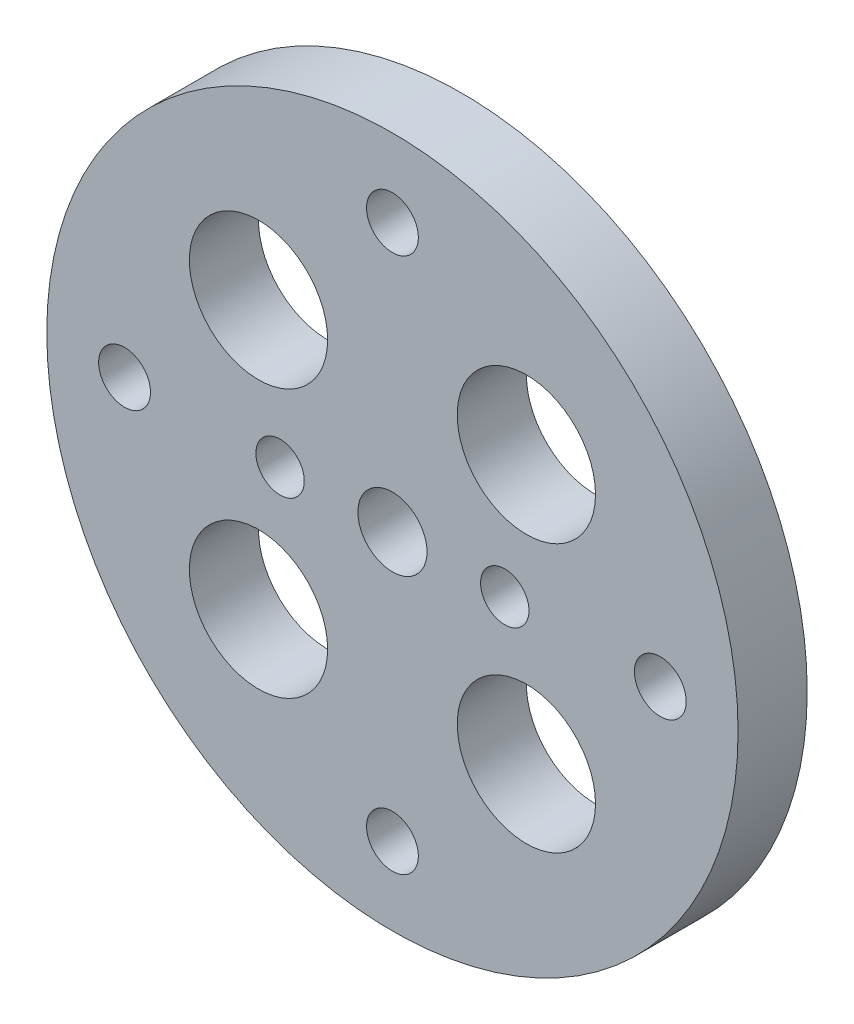
ISO-10303-21;
HEADER;
FILE_DESCRIPTION(('STEP AP214'),'2;1');
FILE_NAME('part.step','',(''),(''),'','','');
FILE_SCHEMA(('AUTOMOTIVE_DESIGN { 1 0 10303 214 1 1 1 1 }'));
ENDSEC;
DATA;
#1=APPLICATION_CONTEXT('core data for automotive mechanical design processes');
#2=APPLICATION_PROTOCOL_DEFINITION('international standard','automotive_design',2000,#1);
#3=PRODUCT_CONTEXT('',#1,'mechanical');
#4=PRODUCT('Part','Part','',(#3));
#5=PRODUCT_RELATED_PRODUCT_CATEGORY('part','',(#4));
#6=PRODUCT_DEFINITION_FORMATION('','',#4);
#7=PRODUCT_DEFINITION_CONTEXT('part definition',#1,'design');
#8=PRODUCT_DEFINITION('design','',#6,#7);
#9=PRODUCT_DEFINITION_SHAPE('','',#8);
#10=(LENGTH_UNIT() NAMED_UNIT(*) SI_UNIT(.MILLI.,.METRE.));
#11=(NAMED_UNIT(*) PLANE_ANGLE_UNIT() SI_UNIT($,.RADIAN.));
#12=(NAMED_UNIT(*) SI_UNIT($,.STERADIAN.) SOLID_ANGLE_UNIT());
#13=UNCERTAINTY_MEASURE_WITH_UNIT(LENGTH_MEASURE(1.E-05),#10,'distance_accuracy_value','');
#14=(GEOMETRIC_REPRESENTATION_CONTEXT(3) GLOBAL_UNCERTAINTY_ASSIGNED_CONTEXT((#13)) GLOBAL_UNIT_ASSIGNED_CONTEXT((#10,
#11,#12)) REPRESENTATION_CONTEXT('',''));
#15=CARTESIAN_POINT('',(0.,0.,0.));
#16=DIRECTION('',(0.,0.,1.));
#17=DIRECTION('',(1.,0.,0.));
#18=AXIS2_PLACEMENT_3D('',#15,#16,#17);
#19=CARTESIAN_POINT('',(0.,0.,4.));
#20=DIRECTION('',(0.,0.,1.));
#21=DIRECTION('',(1.,0.,0.));
#22=AXIS2_PLACEMENT_3D('',#19,#20,#21);
#23=PLANE('',#22);
#24=CARTESIAN_POINT('',(7.75000000000043,-7.74999999999957,4.));
#25=DIRECTION('',(0.,0.,1.));
#26=DIRECTION('',(1.,0.,0.));
#27=AXIS2_PLACEMENT_3D('',#24,#25,#26);
#28=CIRCLE('',#27,4.00000000000067);
#29=CARTESIAN_POINT('',(11.7500000000011,-7.74999999999957,4.));
#30=VERTEX_POINT('',#29);
#31=EDGE_CURVE('E120',#30,#30,#28,.T.);
#32=ORIENTED_EDGE('',*,*,#31,.F.);
#33=EDGE_LOOP('',(#32));
#34=FACE_BOUND('',#33,.T.);
#35=CARTESIAN_POINT('',(-7.75,7.75,4.));
#36=DIRECTION('',(0.,0.,1.));
#37=DIRECTION('',(1.,0.,0.));
#38=AXIS2_PLACEMENT_3D('',#35,#36,#37);
#39=CIRCLE('',#38,4.00000000000006);
#40=CARTESIAN_POINT('',(-3.74999999999994,7.75,4.));
#41=VERTEX_POINT('',#40);
#42=EDGE_CURVE('E104',#41,#41,#39,.T.);
#43=ORIENTED_EDGE('',*,*,#42,.F.);
#44=EDGE_LOOP('',(#43));
#45=FACE_BOUND('',#44,.T.);
#46=CARTESIAN_POINT('',(1.08235921504137E-13,15.5,4.));
#47=DIRECTION('',(0.,0.,1.));
#48=DIRECTION('',(1.,0.,0.));
#49=AXIS2_PLACEMENT_3D('',#46,#47,#48);
#50=CIRCLE('',#49,1.5);
#51=CARTESIAN_POINT('',(1.50000000000011,15.5,4.));
#52=VERTEX_POINT('',#51);
#53=EDGE_CURVE('E88',#52,#52,#50,.T.);
#54=ORIENTED_EDGE('',*,*,#53,.F.);
#55=EDGE_LOOP('',(#54));
#56=FACE_BOUND('',#55,.T.);
#57=CARTESIAN_POINT('',(-6.5,0.,4.));
#58=DIRECTION('',(0.,0.,1.));
#59=DIRECTION('',(-1.,0.,0.));
#60=AXIS2_PLACEMENT_3D('',#57,#58,#59);
#61=CIRCLE('',#60,1.4);
#62=CARTESIAN_POINT('',(-7.9,0.,4.));
#63=VERTEX_POINT('',#62);
#64=EDGE_CURVE('E72',#63,#63,#61,.T.);
#65=ORIENTED_EDGE('',*,*,#64,.F.);
#66=EDGE_LOOP('',(#65));
#67=FACE_BOUND('',#66,.T.);
#68=CARTESIAN_POINT('',(6.5,0.,4.));
#69=DIRECTION('',(0.,0.,1.));
#70=DIRECTION('',(1.,0.,0.));
#71=AXIS2_PLACEMENT_3D('',#68,#69,#70);
#72=CIRCLE('',#71,1.4);
#73=CARTESIAN_POINT('',(7.9,0.,4.));
#74=VERTEX_POINT('',#73);
#75=EDGE_CURVE('E56',#74,#74,#72,.T.);
#76=ORIENTED_EDGE('',*,*,#75,.F.);
#77=EDGE_LOOP('',(#76));
#78=FACE_BOUND('',#77,.T.);
#79=CARTESIAN_POINT('',(0.,0.,4.));
#80=DIRECTION('',(0.,0.,1.));
#81=DIRECTION('',(1.,0.,0.));
#82=AXIS2_PLACEMENT_3D('',#79,#80,#81);
#83=CIRCLE('',#82,20.);
#84=CARTESIAN_POINT('',(20.,0.,4.));
#85=VERTEX_POINT('',#84);
#86=EDGE_CURVE('E10',#85,#85,#83,.T.);
#87=ORIENTED_EDGE('',*,*,#86,.T.);
#88=EDGE_LOOP('',(#87));
#89=FACE_BOUND('',#88,.T.);
#90=CARTESIAN_POINT('',(0.,0.,4.));
#91=DIRECTION('',(0.,0.,1.));
#92=DIRECTION('',(1.,0.,0.));
#93=AXIS2_PLACEMENT_3D('',#90,#91,#92);
#94=CIRCLE('',#93,2.);
#95=CARTESIAN_POINT('',(2.,0.,4.));
#96=VERTEX_POINT('',#95);
#97=EDGE_CURVE('E50',#96,#96,#94,.T.);
#98=ORIENTED_EDGE('',*,*,#97,.F.);
#99=EDGE_LOOP('',(#98));
#100=FACE_BOUND('',#99,.T.);
#101=CARTESIAN_POINT('',(0.,-15.5,4.));
#102=DIRECTION('',(0.,0.,1.));
#103=DIRECTION('',(1.,0.,0.));
#104=AXIS2_PLACEMENT_3D('',#101,#102,#103);
#105=CIRCLE('',#104,1.5);
#106=CARTESIAN_POINT('',(1.5,-15.5,4.));
#107=VERTEX_POINT('',#106);
#108=EDGE_CURVE('E64',#107,#107,#105,.T.);
#109=ORIENTED_EDGE('',*,*,#108,.F.);
#110=EDGE_LOOP('',(#109));
#111=FACE_BOUND('',#110,.T.);
#112=CARTESIAN_POINT('',(-15.5,0.,4.));
#113=DIRECTION('',(0.,0.,1.));
#114=DIRECTION('',(1.,0.,0.));
#115=AXIS2_PLACEMENT_3D('',#112,#113,#114);
#116=CIRCLE('',#115,1.5);
#117=CARTESIAN_POINT('',(-14.,0.,4.));
#118=VERTEX_POINT('',#117);
#119=EDGE_CURVE('E80',#118,#118,#116,.T.);
#120=ORIENTED_EDGE('',*,*,#119,.F.);
#121=EDGE_LOOP('',(#120));
#122=FACE_BOUND('',#121,.T.);
#123=CARTESIAN_POINT('',(15.5,-1.62353882256206E-13,4.));
#124=DIRECTION('',(0.,0.,1.));
#125=DIRECTION('',(1.,0.,0.));
#126=AXIS2_PLACEMENT_3D('',#123,#124,#125);
#127=CIRCLE('',#126,1.5);
#128=CARTESIAN_POINT('',(17.,-1.62353882256206E-13,4.));
#129=VERTEX_POINT('',#128);
#130=EDGE_CURVE('E96',#129,#129,#127,.T.);
#131=ORIENTED_EDGE('',*,*,#130,.F.);
#132=EDGE_LOOP('',(#131));
#133=FACE_BOUND('',#132,.T.);
#134=CARTESIAN_POINT('',(7.75,7.75000000000043,4.));
#135=DIRECTION('',(0.,0.,1.));
#136=DIRECTION('',(1.,0.,0.));
#137=AXIS2_PLACEMENT_3D('',#134,#135,#136);
#138=CIRCLE('',#137,4.00000000000051);
#139=CARTESIAN_POINT('',(11.7500000000005,7.75000000000043,4.));
#140=VERTEX_POINT('',#139);
#141=EDGE_CURVE('E112',#140,#140,#138,.T.);
#142=ORIENTED_EDGE('',*,*,#141,.F.);
#143=EDGE_LOOP('',(#142));
#144=FACE_BOUND('',#143,.T.);
#145=CARTESIAN_POINT('',(-7.74999999999957,-7.75,4.));
#146=DIRECTION('',(0.,0.,1.));
#147=DIRECTION('',(1.,0.,0.));
#148=AXIS2_PLACEMENT_3D('',#145,#146,#147);
#149=CIRCLE('',#148,4.00000000000029);
#150=CARTESIAN_POINT('',(-3.74999999999928,-7.75,4.));
#151=VERTEX_POINT('',#150);
#152=EDGE_CURVE('E128',#151,#151,#149,.T.);
#153=ORIENTED_EDGE('',*,*,#152,.F.);
#154=EDGE_LOOP('',(#153));
#155=FACE_BOUND('',#154,.T.);
#156=ADVANCED_FACE('F37',(#34,#45,#56,#67,#78,#89,#100,#111,#122,#133,#144,#155),#23,.T.);
#157=CARTESIAN_POINT('',(0.,0.,0.));
#158=DIRECTION('',(0.,0.,1.));
#159=DIRECTION('',(1.,0.,0.));
#160=AXIS2_PLACEMENT_3D('',#157,#158,#159);
#161=PLANE('',#160);
#162=CARTESIAN_POINT('',(0.,0.,0.));
#163=DIRECTION('',(0.,0.,1.));
#164=DIRECTION('',(1.,0.,0.));
#165=AXIS2_PLACEMENT_3D('',#162,#163,#164);
#166=CIRCLE('',#165,20.);
#167=CARTESIAN_POINT('',(20.,0.,0.));
#168=VERTEX_POINT('',#167);
#169=EDGE_CURVE('E41',#168,#168,#166,.T.);
#170=ORIENTED_EDGE('',*,*,#169,.F.);
#171=EDGE_LOOP('',(#170));
#172=FACE_BOUND('',#171,.T.);
#173=CARTESIAN_POINT('',(0.,0.,0.));
#174=DIRECTION('',(0.,0.,1.));
#175=DIRECTION('',(1.,0.,0.));
#176=AXIS2_PLACEMENT_3D('',#173,#174,#175);
#177=CIRCLE('',#176,2.);
#178=CARTESIAN_POINT('',(2.,0.,0.));
#179=VERTEX_POINT('',#178);
#180=EDGE_CURVE('E52',#179,#179,#177,.T.);
#181=ORIENTED_EDGE('',*,*,#180,.T.);
#182=EDGE_LOOP('',(#181));
#183=FACE_BOUND('',#182,.T.);
#184=CARTESIAN_POINT('',(6.5,0.,0.));
#185=DIRECTION('',(0.,0.,1.));
#186=DIRECTION('',(1.,0.,0.));
#187=AXIS2_PLACEMENT_3D('',#184,#185,#186);
#188=CIRCLE('',#187,1.4);
#189=CARTESIAN_POINT('',(7.9,0.,0.));
#190=VERTEX_POINT('',#189);
#191=EDGE_CURVE('E60',#190,#190,#188,.T.);
#192=ORIENTED_EDGE('',*,*,#191,.T.);
#193=EDGE_LOOP('',(#192));
#194=FACE_BOUND('',#193,.T.);
#195=CARTESIAN_POINT('',(0.,-15.5,0.));
#196=DIRECTION('',(0.,0.,1.));
#197=DIRECTION('',(1.,0.,0.));
#198=AXIS2_PLACEMENT_3D('',#195,#196,#197);
#199=CIRCLE('',#198,1.5);
#200=CARTESIAN_POINT('',(1.5,-15.5,0.));
#201=VERTEX_POINT('',#200);
#202=EDGE_CURVE('E68',#201,#201,#199,.T.);
#203=ORIENTED_EDGE('',*,*,#202,.T.);
#204=EDGE_LOOP('',(#203));
#205=FACE_BOUND('',#204,.T.);
#206=CARTESIAN_POINT('',(-6.5,0.,0.));
#207=DIRECTION('',(0.,0.,1.));
#208=DIRECTION('',(-1.,0.,0.));
#209=AXIS2_PLACEMENT_3D('',#206,#207,#208);
#210=CIRCLE('',#209,1.4);
#211=CARTESIAN_POINT('',(-7.9,0.,0.));
#212=VERTEX_POINT('',#211);
#213=EDGE_CURVE('E76',#212,#212,#210,.T.);
#214=ORIENTED_EDGE('',*,*,#213,.T.);
#215=EDGE_LOOP('',(#214));
#216=FACE_BOUND('',#215,.T.);
#217=CARTESIAN_POINT('',(-15.5,0.,0.));
#218=DIRECTION('',(0.,0.,1.));
#219=DIRECTION('',(1.,0.,0.));
#220=AXIS2_PLACEMENT_3D('',#217,#218,#219);
#221=CIRCLE('',#220,1.5);
#222=CARTESIAN_POINT('',(-14.,0.,0.));
#223=VERTEX_POINT('',#222);
#224=EDGE_CURVE('E84',#223,#223,#221,.T.);
#225=ORIENTED_EDGE('',*,*,#224,.T.);
#226=EDGE_LOOP('',(#225));
#227=FACE_BOUND('',#226,.T.);
#228=CARTESIAN_POINT('',(1.08235921504137E-13,15.5,0.));
#229=DIRECTION('',(0.,0.,1.));
#230=DIRECTION('',(1.,0.,0.));
#231=AXIS2_PLACEMENT_3D('',#228,#229,#230);
#232=CIRCLE('',#231,1.5);
#233=CARTESIAN_POINT('',(1.50000000000011,15.5,0.));
#234=VERTEX_POINT('',#233);
#235=EDGE_CURVE('E92',#234,#234,#232,.T.);
#236=ORIENTED_EDGE('',*,*,#235,.T.);
#237=EDGE_LOOP('',(#236));
#238=FACE_BOUND('',#237,.T.);
#239=CARTESIAN_POINT('',(15.5,-1.62353882256206E-13,0.));
#240=DIRECTION('',(0.,0.,1.));
#241=DIRECTION('',(1.,0.,0.));
#242=AXIS2_PLACEMENT_3D('',#239,#240,#241);
#243=CIRCLE('',#242,1.5);
#244=CARTESIAN_POINT('',(17.,-1.62353882256206E-13,0.));
#245=VERTEX_POINT('',#244);
#246=EDGE_CURVE('E100',#245,#245,#243,.T.);
#247=ORIENTED_EDGE('',*,*,#246,.T.);
#248=EDGE_LOOP('',(#247));
#249=FACE_BOUND('',#248,.T.);
#250=CARTESIAN_POINT('',(-7.75,7.75,0.));
#251=DIRECTION('',(0.,0.,1.));
#252=DIRECTION('',(1.,0.,0.));
#253=AXIS2_PLACEMENT_3D('',#250,#251,#252);
#254=CIRCLE('',#253,4.00000000000006);
#255=CARTESIAN_POINT('',(-3.74999999999994,7.75,0.));
#256=VERTEX_POINT('',#255);
#257=EDGE_CURVE('E108',#256,#256,#254,.T.);
#258=ORIENTED_EDGE('',*,*,#257,.T.);
#259=EDGE_LOOP('',(#258));
#260=FACE_BOUND('',#259,.T.);
#261=CARTESIAN_POINT('',(7.75,7.75000000000043,0.));
#262=DIRECTION('',(0.,0.,1.));
#263=DIRECTION('',(1.,0.,0.));
#264=AXIS2_PLACEMENT_3D('',#261,#262,#263);
#265=CIRCLE('',#264,4.00000000000051);
#266=CARTESIAN_POINT('',(11.7500000000005,7.75000000000043,0.));
#267=VERTEX_POINT('',#266);
#268=EDGE_CURVE('E116',#267,#267,#265,.T.);
#269=ORIENTED_EDGE('',*,*,#268,.T.);
#270=EDGE_LOOP('',(#269));
#271=FACE_BOUND('',#270,.T.);
#272=CARTESIAN_POINT('',(7.75000000000043,-7.74999999999957,0.));
#273=DIRECTION('',(0.,0.,1.));
#274=DIRECTION('',(1.,0.,0.));
#275=AXIS2_PLACEMENT_3D('',#272,#273,#274);
#276=CIRCLE('',#275,4.00000000000067);
#277=CARTESIAN_POINT('',(11.7500000000011,-7.74999999999957,0.));
#278=VERTEX_POINT('',#277);
#279=EDGE_CURVE('E124',#278,#278,#276,.T.);
#280=ORIENTED_EDGE('',*,*,#279,.T.);
#281=EDGE_LOOP('',(#280));
#282=FACE_BOUND('',#281,.T.);
#283=CARTESIAN_POINT('',(-7.74999999999957,-7.75,0.));
#284=DIRECTION('',(0.,0.,1.));
#285=DIRECTION('',(1.,0.,0.));
#286=AXIS2_PLACEMENT_3D('',#283,#284,#285);
#287=CIRCLE('',#286,4.00000000000029);
#288=CARTESIAN_POINT('',(-3.74999999999928,-7.75,0.));
#289=VERTEX_POINT('',#288);
#290=EDGE_CURVE('E132',#289,#289,#287,.T.);
#291=ORIENTED_EDGE('',*,*,#290,.T.);
#292=EDGE_LOOP('',(#291));
#293=FACE_BOUND('',#292,.T.);
#294=ADVANCED_FACE('F144',(#172,#183,#194,#205,#216,#227,#238,#249,#260,#271,#282,#293),#161,.F.);
#295=CARTESIAN_POINT('',(0.,0.,4.));
#296=DIRECTION('',(0.,0.,-1.));
#297=DIRECTION('',(-1.,0.,0.));
#298=AXIS2_PLACEMENT_3D('',#295,#296,#297);
#299=CYLINDRICAL_SURFACE('',#298,20.);
#300=ORIENTED_EDGE('',*,*,#86,.F.);
#301=EDGE_LOOP('',(#300));
#302=FACE_BOUND('',#301,.T.);
#303=ORIENTED_EDGE('',*,*,#169,.T.);
#304=EDGE_LOOP('',(#303));
#305=FACE_BOUND('',#304,.T.);
#306=ADVANCED_FACE('F39',(#302,#305),#299,.T.);
#307=CARTESIAN_POINT('',(0.,0.,4.));
#308=DIRECTION('',(0.,0.,-1.));
#309=DIRECTION('',(-1.,0.,0.));
#310=AXIS2_PLACEMENT_3D('',#307,#308,#309);
#311=CYLINDRICAL_SURFACE('',#310,2.);
#312=ORIENTED_EDGE('',*,*,#97,.T.);
#313=EDGE_LOOP('',(#312));
#314=FACE_BOUND('',#313,.T.);
#315=ORIENTED_EDGE('',*,*,#180,.F.);
#316=EDGE_LOOP('',(#315));
#317=FACE_BOUND('',#316,.T.);
#318=ADVANCED_FACE('F154',(#314,#317),#311,.F.);
#319=CARTESIAN_POINT('',(6.5,0.,4.));
#320=DIRECTION('',(0.,0.,-1.));
#321=DIRECTION('',(-1.,0.,0.));
#322=AXIS2_PLACEMENT_3D('',#319,#320,#321);
#323=CYLINDRICAL_SURFACE('',#322,1.4);
#324=ORIENTED_EDGE('',*,*,#75,.T.);
#325=EDGE_LOOP('',(#324));
#326=FACE_BOUND('',#325,.T.);
#327=ORIENTED_EDGE('',*,*,#191,.F.);
#328=EDGE_LOOP('',(#327));
#329=FACE_BOUND('',#328,.T.);
#330=ADVANCED_FACE('F157',(#326,#329),#323,.F.);
#331=CARTESIAN_POINT('',(0.,-15.5,4.));
#332=DIRECTION('',(0.,0.,-1.));
#333=DIRECTION('',(-1.,0.,0.));
#334=AXIS2_PLACEMENT_3D('',#331,#332,#333);
#335=CYLINDRICAL_SURFACE('',#334,1.5);
#336=ORIENTED_EDGE('',*,*,#108,.T.);
#337=EDGE_LOOP('',(#336));
#338=FACE_BOUND('',#337,.T.);
#339=ORIENTED_EDGE('',*,*,#202,.F.);
#340=EDGE_LOOP('',(#339));
#341=FACE_BOUND('',#340,.T.);
#342=ADVANCED_FACE('F161',(#338,#341),#335,.F.);
#343=CARTESIAN_POINT('',(-6.5,0.,4.));
#344=DIRECTION('',(0.,0.,-1.));
#345=DIRECTION('',(-1.,0.,0.));
#346=AXIS2_PLACEMENT_3D('',#343,#344,#345);
#347=CYLINDRICAL_SURFACE('',#346,1.4);
#348=ORIENTED_EDGE('',*,*,#64,.T.);
#349=EDGE_LOOP('',(#348));
#350=FACE_BOUND('',#349,.T.);
#351=ORIENTED_EDGE('',*,*,#213,.F.);
#352=EDGE_LOOP('',(#351));
#353=FACE_BOUND('',#352,.T.);
#354=ADVANCED_FACE('F165',(#350,#353),#347,.F.);
#355=CARTESIAN_POINT('',(-15.5,0.,4.));
#356=DIRECTION('',(0.,0.,-1.));
#357=DIRECTION('',(-1.,0.,0.));
#358=AXIS2_PLACEMENT_3D('',#355,#356,#357);
#359=CYLINDRICAL_SURFACE('',#358,1.5);
#360=ORIENTED_EDGE('',*,*,#119,.T.);
#361=EDGE_LOOP('',(#360));
#362=FACE_BOUND('',#361,.T.);
#363=ORIENTED_EDGE('',*,*,#224,.F.);
#364=EDGE_LOOP('',(#363));
#365=FACE_BOUND('',#364,.T.);
#366=ADVANCED_FACE('F169',(#362,#365),#359,.F.);
#367=CARTESIAN_POINT('',(1.08235921504137E-13,15.5,4.));
#368=DIRECTION('',(0.,0.,-1.));
#369=DIRECTION('',(-1.,0.,0.));
#370=AXIS2_PLACEMENT_3D('',#367,#368,#369);
#371=CYLINDRICAL_SURFACE('',#370,1.5);
#372=ORIENTED_EDGE('',*,*,#53,.T.);
#373=EDGE_LOOP('',(#372));
#374=FACE_BOUND('',#373,.T.);
#375=ORIENTED_EDGE('',*,*,#235,.F.);
#376=EDGE_LOOP('',(#375));
#377=FACE_BOUND('',#376,.T.);
#378=ADVANCED_FACE('F173',(#374,#377),#371,.F.);
#379=CARTESIAN_POINT('',(15.5,-1.62353882256206E-13,4.));
#380=DIRECTION('',(0.,0.,-1.));
#381=DIRECTION('',(-1.,0.,0.));
#382=AXIS2_PLACEMENT_3D('',#379,#380,#381);
#383=CYLINDRICAL_SURFACE('',#382,1.5);
#384=ORIENTED_EDGE('',*,*,#130,.T.);
#385=EDGE_LOOP('',(#384));
#386=FACE_BOUND('',#385,.T.);
#387=ORIENTED_EDGE('',*,*,#246,.F.);
#388=EDGE_LOOP('',(#387));
#389=FACE_BOUND('',#388,.T.);
#390=ADVANCED_FACE('F177',(#386,#389),#383,.F.);
#391=CARTESIAN_POINT('',(-7.75,7.75,4.));
#392=DIRECTION('',(0.,0.,-1.));
#393=DIRECTION('',(-1.,0.,0.));
#394=AXIS2_PLACEMENT_3D('',#391,#392,#393);
#395=CYLINDRICAL_SURFACE('',#394,4.00000000000006);
#396=ORIENTED_EDGE('',*,*,#42,.T.);
#397=EDGE_LOOP('',(#396));
#398=FACE_BOUND('',#397,.T.);
#399=ORIENTED_EDGE('',*,*,#257,.F.);
#400=EDGE_LOOP('',(#399));
#401=FACE_BOUND('',#400,.T.);
#402=ADVANCED_FACE('F181',(#398,#401),#395,.F.);
#403=CARTESIAN_POINT('',(7.75,7.75000000000043,4.));
#404=DIRECTION('',(0.,0.,-1.));
#405=DIRECTION('',(-1.,0.,0.));
#406=AXIS2_PLACEMENT_3D('',#403,#404,#405);
#407=CYLINDRICAL_SURFACE('',#406,4.00000000000051);
#408=ORIENTED_EDGE('',*,*,#141,.T.);
#409=EDGE_LOOP('',(#408));
#410=FACE_BOUND('',#409,.T.);
#411=ORIENTED_EDGE('',*,*,#268,.F.);
#412=EDGE_LOOP('',(#411));
#413=FACE_BOUND('',#412,.T.);
#414=ADVANCED_FACE('F185',(#410,#413),#407,.F.);
#415=CARTESIAN_POINT('',(7.75000000000043,-7.74999999999957,4.));
#416=DIRECTION('',(0.,0.,-1.));
#417=DIRECTION('',(-1.,0.,0.));
#418=AXIS2_PLACEMENT_3D('',#415,#416,#417);
#419=CYLINDRICAL_SURFACE('',#418,4.00000000000067);
#420=ORIENTED_EDGE('',*,*,#31,.T.);
#421=EDGE_LOOP('',(#420));
#422=FACE_BOUND('',#421,.T.);
#423=ORIENTED_EDGE('',*,*,#279,.F.);
#424=EDGE_LOOP('',(#423));
#425=FACE_BOUND('',#424,.T.);
#426=ADVANCED_FACE('F189',(#422,#425),#419,.F.);
#427=CARTESIAN_POINT('',(-7.74999999999957,-7.75,4.));
#428=DIRECTION('',(0.,0.,-1.));
#429=DIRECTION('',(-1.,0.,0.));
#430=AXIS2_PLACEMENT_3D('',#427,#428,#429);
#431=CYLINDRICAL_SURFACE('',#430,4.00000000000029);
#432=ORIENTED_EDGE('',*,*,#152,.T.);
#433=EDGE_LOOP('',(#432));
#434=FACE_BOUND('',#433,.T.);
#435=ORIENTED_EDGE('',*,*,#290,.F.);
#436=EDGE_LOOP('',(#435));
#437=FACE_BOUND('',#436,.T.);
#438=ADVANCED_FACE('F140',(#434,#437),#431,.F.);
#439=CLOSED_SHELL('',(#156,#294,#306,#318,#330,#342,#354,#366,#378,#390,#402,#414,#426,#438));
#440=MANIFOLD_SOLID_BREP('B2',#439);
#441=ADVANCED_BREP_SHAPE_REPRESENTATION('',(#18,#440),#14);
#442=SHAPE_DEFINITION_REPRESENTATION(#9,#441);
ENDSEC;
END-ISO-10303-21;
